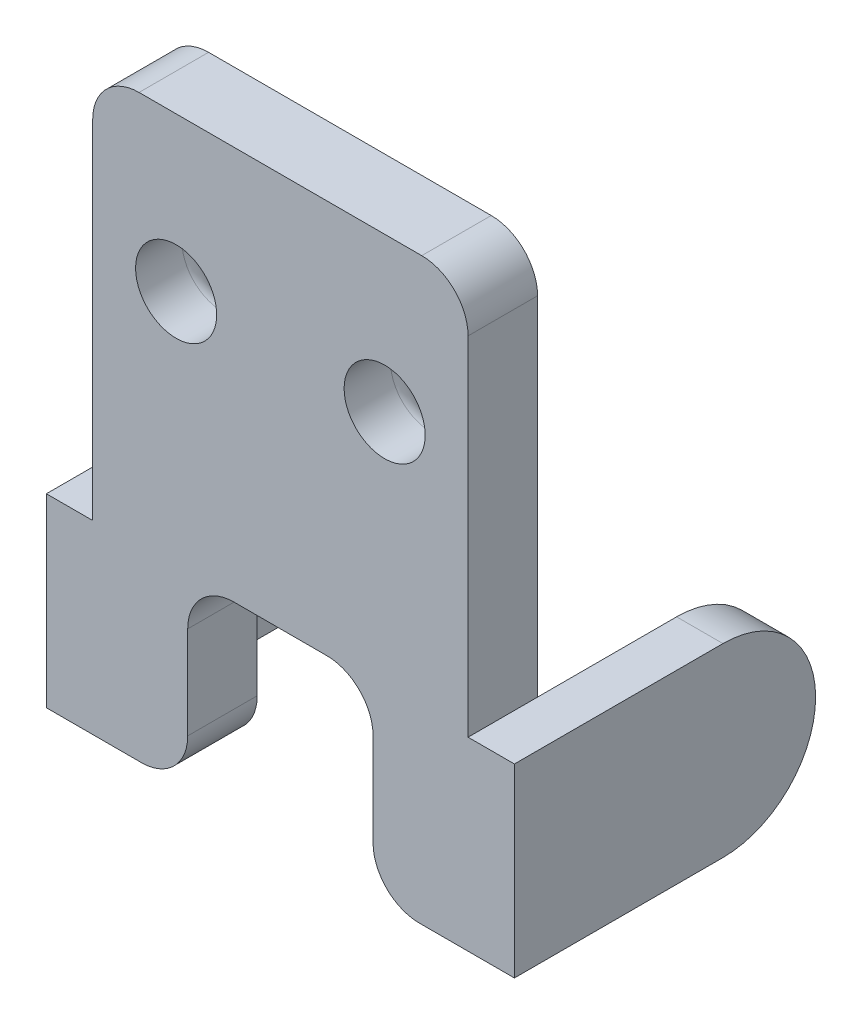
ISO-10303-21;
HEADER;
FILE_DESCRIPTION(('STEP AP214'),'2;1');
FILE_NAME('part.step','',(''),(''),'','','');
FILE_SCHEMA(('AUTOMOTIVE_DESIGN { 1 0 10303 214 1 1 1 1 }'));
ENDSEC;
DATA;
#1=APPLICATION_CONTEXT('core data for automotive mechanical design processes');
#2=APPLICATION_PROTOCOL_DEFINITION('international standard','automotive_design',2000,#1);
#3=PRODUCT_CONTEXT('',#1,'mechanical');
#4=PRODUCT('Part','Part','',(#3));
#5=PRODUCT_RELATED_PRODUCT_CATEGORY('part','',(#4));
#6=PRODUCT_DEFINITION_FORMATION('','',#4);
#7=PRODUCT_DEFINITION_CONTEXT('part definition',#1,'design');
#8=PRODUCT_DEFINITION('design','',#6,#7);
#9=PRODUCT_DEFINITION_SHAPE('','',#8);
#10=(LENGTH_UNIT() NAMED_UNIT(*) SI_UNIT(.MILLI.,.METRE.));
#11=(NAMED_UNIT(*) PLANE_ANGLE_UNIT() SI_UNIT($,.RADIAN.));
#12=(NAMED_UNIT(*) SI_UNIT($,.STERADIAN.) SOLID_ANGLE_UNIT());
#13=UNCERTAINTY_MEASURE_WITH_UNIT(LENGTH_MEASURE(1.E-05),#10,'distance_accuracy_value','');
#14=(GEOMETRIC_REPRESENTATION_CONTEXT(3) GLOBAL_UNCERTAINTY_ASSIGNED_CONTEXT((#13)) GLOBAL_UNIT_ASSIGNED_CONTEXT((#10,
#11,#12)) REPRESENTATION_CONTEXT('',''));
#15=CARTESIAN_POINT('',(0.,0.,0.));
#16=DIRECTION('',(0.,0.,1.));
#17=DIRECTION('',(1.,0.,0.));
#18=AXIS2_PLACEMENT_3D('',#15,#16,#17);
#19=CARTESIAN_POINT('',(0.,0.,3.));
#20=DIRECTION('',(0.,1.,0.));
#21=DIRECTION('',(0.,0.,1.));
#22=AXIS2_PLACEMENT_3D('',#19,#20,#21);
#23=PLANE('',#22);
#24=DIRECTION('',(1.,0.,0.));
#25=VECTOR('',#24,1.);
#26=CARTESIAN_POINT('',(0.,0.,3.));
#27=LINE('',#26,#25);
#28=CARTESIAN_POINT('',(14.1,0.,3.));
#29=VERTEX_POINT('',#28);
#30=CARTESIAN_POINT('',(18.2,0.,3.));
#31=VERTEX_POINT('',#30);
#32=EDGE_CURVE('E190',#29,#31,#27,.T.);
#33=ORIENTED_EDGE('',*,*,#32,.F.);
#34=DIRECTION('',(0.,0.,-1.));
#35=VECTOR('',#34,1.);
#36=CARTESIAN_POINT('',(14.1,0.,3.));
#37=LINE('',#36,#35);
#38=CARTESIAN_POINT('',(14.1,0.,0.));
#39=VERTEX_POINT('',#38);
#40=EDGE_CURVE('E341',#29,#39,#37,.T.);
#41=ORIENTED_EDGE('',*,*,#40,.T.);
#42=DIRECTION('',(1.,0.,0.));
#43=VECTOR('',#42,1.);
#44=CARTESIAN_POINT('',(0.,0.,0.));
#45=LINE('',#44,#43);
#46=CARTESIAN_POINT('',(16.2,0.,0.));
#47=VERTEX_POINT('',#46);
#48=EDGE_CURVE('E262',#39,#47,#45,.T.);
#49=ORIENTED_EDGE('',*,*,#48,.T.);
#50=DIRECTION('',(0.,0.,-1.));
#51=VECTOR('',#50,1.);
#52=CARTESIAN_POINT('',(16.2,0.,3.));
#53=LINE('',#52,#51);
#54=CARTESIAN_POINT('',(16.2,0.,-6.));
#55=VERTEX_POINT('',#54);
#56=EDGE_CURVE('E219',#47,#55,#53,.T.);
#57=ORIENTED_EDGE('',*,*,#56,.T.);
#58=DIRECTION('',(-1.,0.,0.));
#59=VECTOR('',#58,1.);
#60=CARTESIAN_POINT('',(0.,0.,-6.));
#61=LINE('',#60,#59);
#62=CARTESIAN_POINT('',(18.2,0.,-6.));
#63=VERTEX_POINT('',#62);
#64=EDGE_CURVE('E209',#55,#63,#61,.F.);
#65=ORIENTED_EDGE('',*,*,#64,.T.);
#66=DIRECTION('',(0.,0.,-1.));
#67=VECTOR('',#66,1.);
#68=CARTESIAN_POINT('',(18.2,0.,3.));
#69=LINE('',#68,#67);
#70=EDGE_CURVE('E206',#31,#63,#69,.T.);
#71=ORIENTED_EDGE('',*,*,#70,.F.);
#72=EDGE_LOOP('',(#33,#41,#49,#57,#65,#71));
#73=FACE_BOUND('',#72,.T.);
#74=ADVANCED_FACE('F34',(#73),#23,.F.);
#75=CARTESIAN_POINT('',(16.2,0.,3.));
#76=DIRECTION('',(-1.,0.,0.));
#77=DIRECTION('',(0.,0.,1.));
#78=AXIS2_PLACEMENT_3D('',#75,#76,#77);
#79=PLANE('',#78);
#80=DIRECTION('',(0.,1.,0.));
#81=VECTOR('',#80,1.);
#82=CARTESIAN_POINT('',(16.2,0.,0.));
#83=LINE('',#82,#81);
#84=CARTESIAN_POINT('',(16.2,8.,0.));
#85=VERTEX_POINT('',#84);
#86=CARTESIAN_POINT('',(16.2,23.,0.));
#87=VERTEX_POINT('',#86);
#88=EDGE_CURVE('E266',#85,#87,#83,.T.);
#89=ORIENTED_EDGE('',*,*,#88,.T.);
#90=DIRECTION('',(0.,0.,-1.));
#91=VECTOR('',#90,1.);
#92=CARTESIAN_POINT('',(16.2,23.,3.));
#93=LINE('',#92,#91);
#94=CARTESIAN_POINT('',(16.2,23.,3.));
#95=VERTEX_POINT('',#94);
#96=EDGE_CURVE('E11',#87,#95,#93,.F.);
#97=ORIENTED_EDGE('',*,*,#96,.T.);
#98=DIRECTION('',(0.,1.,0.));
#99=VECTOR('',#98,1.);
#100=CARTESIAN_POINT('',(16.2,0.,3.));
#101=LINE('',#100,#99);
#102=CARTESIAN_POINT('',(16.2,8.,3.));
#103=VERTEX_POINT('',#102);
#104=EDGE_CURVE('E255',#103,#95,#101,.T.);
#105=ORIENTED_EDGE('',*,*,#104,.F.);
#106=DIRECTION('',(0.,0.,1.));
#107=VECTOR('',#106,1.);
#108=CARTESIAN_POINT('',(16.2,8.,3.));
#109=LINE('',#108,#107);
#110=EDGE_CURVE('E221',#85,#103,#109,.T.);
#111=ORIENTED_EDGE('',*,*,#110,.F.);
#112=EDGE_LOOP('',(#89,#97,#105,#111));
#113=FACE_BOUND('',#112,.T.);
#114=ADVANCED_FACE('F384',(#113),#79,.F.);
#115=CARTESIAN_POINT('',(0.,0.,3.));
#116=DIRECTION('',(1.,0.,0.));
#117=DIRECTION('',(0.,0.,-1.));
#118=AXIS2_PLACEMENT_3D('',#115,#116,#117);
#119=PLANE('',#118);
#120=DIRECTION('',(0.,-1.,0.));
#121=VECTOR('',#120,1.);
#122=CARTESIAN_POINT('',(0.,0.,3.));
#123=LINE('',#122,#121);
#124=CARTESIAN_POINT('',(0.,23.,3.));
#125=VERTEX_POINT('',#124);
#126=CARTESIAN_POINT('',(0.,8.,3.));
#127=VERTEX_POINT('',#126);
#128=EDGE_CURVE('E203',#125,#127,#123,.T.);
#129=ORIENTED_EDGE('',*,*,#128,.F.);
#130=DIRECTION('',(0.,0.,-1.));
#131=VECTOR('',#130,1.);
#132=CARTESIAN_POINT('',(0.,23.,3.));
#133=LINE('',#132,#131);
#134=CARTESIAN_POINT('',(0.,23.,0.));
#135=VERTEX_POINT('',#134);
#136=EDGE_CURVE('E351',#125,#135,#133,.T.);
#137=ORIENTED_EDGE('',*,*,#136,.T.);
#138=DIRECTION('',(0.,-1.,0.));
#139=VECTOR('',#138,1.);
#140=CARTESIAN_POINT('',(0.,0.,0.));
#141=LINE('',#140,#139);
#142=CARTESIAN_POINT('',(0.,8.,0.));
#143=VERTEX_POINT('',#142);
#144=EDGE_CURVE('E260',#135,#143,#141,.T.);
#145=ORIENTED_EDGE('',*,*,#144,.T.);
#146=DIRECTION('',(0.,0.,-1.));
#147=VECTOR('',#146,1.);
#148=CARTESIAN_POINT('',(0.,8.,3.));
#149=LINE('',#148,#147);
#150=EDGE_CURVE('E245',#127,#143,#149,.T.);
#151=ORIENTED_EDGE('',*,*,#150,.F.);
#152=EDGE_LOOP('',(#129,#137,#145,#151));
#153=FACE_BOUND('',#152,.T.);
#154=ADVANCED_FACE('F370',(#153),#119,.F.);
#155=CARTESIAN_POINT('',(0.,0.,0.));
#156=VERTEX_POINT('',#155);
#157=CARTESIAN_POINT('',(2.1,0.,0.));
#158=VERTEX_POINT('',#157);
#159=EDGE_CURVE('E263',#156,#158,#45,.T.);
#160=ORIENTED_EDGE('',*,*,#159,.T.);
#161=DIRECTION('',(0.,0.,-1.));
#162=VECTOR('',#161,1.);
#163=CARTESIAN_POINT('',(2.1,0.,3.));
#164=LINE('',#163,#162);
#165=CARTESIAN_POINT('',(2.1,0.,3.));
#166=VERTEX_POINT('',#165);
#167=EDGE_CURVE('E326',#158,#166,#164,.F.);
#168=ORIENTED_EDGE('',*,*,#167,.T.);
#169=CARTESIAN_POINT('',(-2.,0.,3.));
#170=VERTEX_POINT('',#169);
#171=EDGE_CURVE('E202',#170,#166,#27,.T.);
#172=ORIENTED_EDGE('',*,*,#171,.F.);
#173=DIRECTION('',(0.,0.,1.));
#174=VECTOR('',#173,1.);
#175=CARTESIAN_POINT('',(-2.,0.,3.));
#176=LINE('',#175,#174);
#177=CARTESIAN_POINT('',(-2.,0.,-6.));
#178=VERTEX_POINT('',#177);
#179=EDGE_CURVE('E242',#178,#170,#176,.T.);
#180=ORIENTED_EDGE('',*,*,#179,.F.);
#181=DIRECTION('',(1.,0.,0.));
#182=VECTOR('',#181,1.);
#183=CARTESIAN_POINT('',(0.,0.,-6.));
#184=LINE('',#183,#182);
#185=CARTESIAN_POINT('',(0.,0.,-6.));
#186=VERTEX_POINT('',#185);
#187=EDGE_CURVE('E296',#178,#186,#184,.T.);
#188=ORIENTED_EDGE('',*,*,#187,.T.);
#189=DIRECTION('',(0.,0.,1.));
#190=VECTOR('',#189,1.);
#191=CARTESIAN_POINT('',(0.,0.,3.));
#192=LINE('',#191,#190);
#193=EDGE_CURVE('E239',#186,#156,#192,.T.);
#194=ORIENTED_EDGE('',*,*,#193,.T.);
#195=EDGE_LOOP('',(#160,#168,#172,#180,#188,#194));
#196=FACE_BOUND('',#195,.T.);
#197=ADVANCED_FACE('F442',(#196),#23,.F.);
#198=CARTESIAN_POINT('',(0.,25.,3.));
#199=DIRECTION('',(0.,-1.,0.));
#200=DIRECTION('',(0.,0.,-1.));
#201=AXIS2_PLACEMENT_3D('',#198,#199,#200);
#202=PLANE('',#201);
#203=DIRECTION('',(-1.,0.,0.));
#204=VECTOR('',#203,1.);
#205=CARTESIAN_POINT('',(0.,25.,0.));
#206=LINE('',#205,#204);
#207=CARTESIAN_POINT('',(14.2,25.,0.));
#208=VERTEX_POINT('',#207);
#209=CARTESIAN_POINT('',(2.,25.,0.));
#210=VERTEX_POINT('',#209);
#211=EDGE_CURVE('E252',#208,#210,#206,.T.);
#212=ORIENTED_EDGE('',*,*,#211,.T.);
#213=DIRECTION('',(0.,0.,-1.));
#214=VECTOR('',#213,1.);
#215=CARTESIAN_POINT('',(2.,25.,3.));
#216=LINE('',#215,#214);
#217=CARTESIAN_POINT('',(2.,25.,3.));
#218=VERTEX_POINT('',#217);
#219=EDGE_CURVE('E55',#210,#218,#216,.F.);
#220=ORIENTED_EDGE('',*,*,#219,.T.);
#221=DIRECTION('',(-1.,0.,0.));
#222=VECTOR('',#221,1.);
#223=CARTESIAN_POINT('',(0.,25.,3.));
#224=LINE('',#223,#222);
#225=CARTESIAN_POINT('',(14.2,25.,3.));
#226=VERTEX_POINT('',#225);
#227=EDGE_CURVE('E257',#226,#218,#224,.T.);
#228=ORIENTED_EDGE('',*,*,#227,.F.);
#229=DIRECTION('',(0.,0.,-1.));
#230=VECTOR('',#229,1.);
#231=CARTESIAN_POINT('',(14.2,25.,3.));
#232=LINE('',#231,#230);
#233=EDGE_CURVE('E358',#226,#208,#232,.T.);
#234=ORIENTED_EDGE('',*,*,#233,.T.);
#235=EDGE_LOOP('',(#212,#220,#228,#234));
#236=FACE_BOUND('',#235,.T.);
#237=ADVANCED_FACE('F377',(#236),#202,.F.);
#238=CARTESIAN_POINT('',(0.,0.,3.));
#239=DIRECTION('',(0.,0.,-1.));
#240=DIRECTION('',(-1.,0.,0.));
#241=AXIS2_PLACEMENT_3D('',#238,#239,#240);
#242=PLANE('',#241);
#243=CARTESIAN_POINT('',(3.6,18.360124913352,3.));
#244=DIRECTION('',(0.,0.,-1.));
#245=DIRECTION('',(-1.,0.,0.));
#246=AXIS2_PLACEMENT_3D('',#243,#244,#245);
#247=CIRCLE('',#246,1.75);
#248=CARTESIAN_POINT('',(1.85,18.360124913352,3.));
#249=VERTEX_POINT('',#248);
#250=EDGE_CURVE('E314',#249,#249,#247,.F.);
#251=ORIENTED_EDGE('',*,*,#250,.F.);
#252=EDGE_LOOP('',(#251));
#253=FACE_BOUND('',#252,.T.);
#254=CARTESIAN_POINT('',(12.6,18.360124913352,3.));
#255=DIRECTION('',(0.,0.,-1.));
#256=DIRECTION('',(-1.,0.,0.));
#257=AXIS2_PLACEMENT_3D('',#254,#255,#256);
#258=CIRCLE('',#257,1.75);
#259=CARTESIAN_POINT('',(10.85,18.360124913352,3.));
#260=VERTEX_POINT('',#259);
#261=EDGE_CURVE('E472',#260,#260,#258,.F.);
#262=ORIENTED_EDGE('',*,*,#261,.F.);
#263=EDGE_LOOP('',(#262));
#264=FACE_BOUND('',#263,.T.);
#265=ORIENTED_EDGE('',*,*,#227,.T.);
#266=CARTESIAN_POINT('',(2.,23.,3.));
#267=DIRECTION('',(0.,0.,-1.));
#268=DIRECTION('',(-1.,0.,0.));
#269=AXIS2_PLACEMENT_3D('',#266,#267,#268);
#270=CIRCLE('',#269,2.);
#271=EDGE_CURVE('E42',#218,#125,#270,.F.);
#272=ORIENTED_EDGE('',*,*,#271,.T.);
#273=ORIENTED_EDGE('',*,*,#128,.T.);
#274=DIRECTION('',(1.,0.,0.));
#275=VECTOR('',#274,1.);
#276=CARTESIAN_POINT('',(-2.,8.,3.));
#277=LINE('',#276,#275);
#278=CARTESIAN_POINT('',(-2.,8.,3.));
#279=VERTEX_POINT('',#278);
#280=EDGE_CURVE('E244',#279,#127,#277,.T.);
#281=ORIENTED_EDGE('',*,*,#280,.F.);
#282=DIRECTION('',(0.,1.,0.));
#283=VECTOR('',#282,1.);
#284=CARTESIAN_POINT('',(-2.,0.,3.));
#285=LINE('',#284,#283);
#286=EDGE_CURVE('E235',#170,#279,#285,.T.);
#287=ORIENTED_EDGE('',*,*,#286,.F.);
#288=ORIENTED_EDGE('',*,*,#171,.T.);
#289=CARTESIAN_POINT('',(2.1,2.,3.));
#290=DIRECTION('',(0.,0.,-1.));
#291=DIRECTION('',(-1.,0.,0.));
#292=AXIS2_PLACEMENT_3D('',#289,#290,#291);
#293=CIRCLE('',#292,2.);
#294=CARTESIAN_POINT('',(4.1,2.,3.));
#295=VERTEX_POINT('',#294);
#296=EDGE_CURVE('E329',#166,#295,#293,.F.);
#297=ORIENTED_EDGE('',*,*,#296,.T.);
#298=DIRECTION('',(0.,-1.,0.));
#299=VECTOR('',#298,1.);
#300=CARTESIAN_POINT('',(4.1,0.,3.));
#301=LINE('',#300,#299);
#302=CARTESIAN_POINT('',(4.09999999999999,6.,3.));
#303=VERTEX_POINT('',#302);
#304=EDGE_CURVE('E413',#303,#295,#301,.T.);
#305=ORIENTED_EDGE('',*,*,#304,.F.);
#306=CARTESIAN_POINT('',(6.09999999999999,6.,3.));
#307=DIRECTION('',(0.,0.,-1.));
#308=DIRECTION('',(-1.,0.,0.));
#309=AXIS2_PLACEMENT_3D('',#306,#307,#308);
#310=CIRCLE('',#309,2.);
#311=CARTESIAN_POINT('',(6.09999999999999,8.,3.));
#312=VERTEX_POINT('',#311);
#313=EDGE_CURVE('E345',#303,#312,#310,.T.);
#314=ORIENTED_EDGE('',*,*,#313,.T.);
#315=DIRECTION('',(-1.,0.,0.));
#316=VECTOR('',#315,1.);
#317=CARTESIAN_POINT('',(12.1,8.,3.));
#318=LINE('',#317,#316);
#319=CARTESIAN_POINT('',(10.1,8.,3.));
#320=VERTEX_POINT('',#319);
#321=EDGE_CURVE('E408',#320,#312,#318,.T.);
#322=ORIENTED_EDGE('',*,*,#321,.F.);
#323=CARTESIAN_POINT('',(10.1,6.,3.));
#324=DIRECTION('',(0.,0.,-1.));
#325=DIRECTION('',(-1.,0.,0.));
#326=AXIS2_PLACEMENT_3D('',#323,#324,#325);
#327=CIRCLE('',#326,2.);
#328=CARTESIAN_POINT('',(12.1,6.,3.));
#329=VERTEX_POINT('',#328);
#330=EDGE_CURVE('E349',#320,#329,#327,.T.);
#331=ORIENTED_EDGE('',*,*,#330,.T.);
#332=DIRECTION('',(0.,1.,0.));
#333=VECTOR('',#332,1.);
#334=CARTESIAN_POINT('',(12.1,0.,3.));
#335=LINE('',#334,#333);
#336=CARTESIAN_POINT('',(12.1,2.,3.));
#337=VERTEX_POINT('',#336);
#338=EDGE_CURVE('E403',#337,#329,#335,.T.);
#339=ORIENTED_EDGE('',*,*,#338,.F.);
#340=CARTESIAN_POINT('',(14.1,2.,3.));
#341=DIRECTION('',(0.,0.,-1.));
#342=DIRECTION('',(-1.,0.,0.));
#343=AXIS2_PLACEMENT_3D('',#340,#341,#342);
#344=CIRCLE('',#343,2.);
#345=EDGE_CURVE('E198',#337,#29,#344,.F.);
#346=ORIENTED_EDGE('',*,*,#345,.T.);
#347=ORIENTED_EDGE('',*,*,#32,.T.);
#348=DIRECTION('',(0.,-1.,0.));
#349=VECTOR('',#348,1.);
#350=CARTESIAN_POINT('',(18.2,0.,3.));
#351=LINE('',#350,#349);
#352=CARTESIAN_POINT('',(18.2,8.,3.));
#353=VERTEX_POINT('',#352);
#354=EDGE_CURVE('E195',#353,#31,#351,.T.);
#355=ORIENTED_EDGE('',*,*,#354,.F.);
#356=DIRECTION('',(-1.,0.,0.));
#357=VECTOR('',#356,1.);
#358=CARTESIAN_POINT('',(18.2,8.,3.));
#359=LINE('',#358,#357);
#360=EDGE_CURVE('E227',#353,#103,#359,.T.);
#361=ORIENTED_EDGE('',*,*,#360,.T.);
#362=ORIENTED_EDGE('',*,*,#104,.T.);
#363=CARTESIAN_POINT('',(14.2,23.,3.));
#364=DIRECTION('',(0.,0.,-1.));
#365=DIRECTION('',(-1.,0.,0.));
#366=AXIS2_PLACEMENT_3D('',#363,#364,#365);
#367=CIRCLE('',#366,2.);
#368=EDGE_CURVE('E362',#95,#226,#367,.F.);
#369=ORIENTED_EDGE('',*,*,#368,.T.);
#370=EDGE_LOOP('',(#265,#272,#273,#281,#287,#288,#297,#305,#314,#322,#331,#339,#346,#347,#355,
#361,#362,#369));
#371=FACE_BOUND('',#370,.T.);
#372=ADVANCED_FACE('F192',(#253,#264,#371),#242,.F.);
#373=CARTESIAN_POINT('',(0.,0.,0.));
#374=DIRECTION('',(0.,0.,-1.));
#375=DIRECTION('',(-1.,0.,0.));
#376=AXIS2_PLACEMENT_3D('',#373,#374,#375);
#377=PLANE('',#376);
#378=CARTESIAN_POINT('',(3.6,18.360124913352,0.));
#379=DIRECTION('',(0.,0.,-1.));
#380=DIRECTION('',(-1.,0.,0.));
#381=AXIS2_PLACEMENT_3D('',#378,#379,#380);
#382=CIRCLE('',#381,2.75);
#383=CARTESIAN_POINT('',(0.849999999999998,18.360124913352,0.));
#384=VERTEX_POINT('',#383);
#385=EDGE_CURVE('E279',#384,#384,#382,.F.);
#386=ORIENTED_EDGE('',*,*,#385,.T.);
#387=EDGE_LOOP('',(#386));
#388=FACE_BOUND('',#387,.T.);
#389=CARTESIAN_POINT('',(12.6,18.360124913352,0.));
#390=DIRECTION('',(0.,0.,-1.));
#391=DIRECTION('',(-1.,0.,0.));
#392=AXIS2_PLACEMENT_3D('',#389,#390,#391);
#393=CIRCLE('',#392,2.75);
#394=CARTESIAN_POINT('',(9.85,18.360124913352,0.));
#395=VERTEX_POINT('',#394);
#396=EDGE_CURVE('E276',#395,#395,#393,.F.);
#397=ORIENTED_EDGE('',*,*,#396,.T.);
#398=EDGE_LOOP('',(#397));
#399=FACE_BOUND('',#398,.T.);
#400=ORIENTED_EDGE('',*,*,#144,.F.);
#401=CARTESIAN_POINT('',(2.,23.,0.));
#402=DIRECTION('',(0.,0.,-1.));
#403=DIRECTION('',(-1.,0.,0.));
#404=AXIS2_PLACEMENT_3D('',#401,#402,#403);
#405=CIRCLE('',#404,2.);
#406=EDGE_CURVE('E356',#135,#210,#405,.T.);
#407=ORIENTED_EDGE('',*,*,#406,.T.);
#408=ORIENTED_EDGE('',*,*,#211,.F.);
#409=CARTESIAN_POINT('',(14.2,23.,0.));
#410=DIRECTION('',(0.,0.,-1.));
#411=DIRECTION('',(-1.,0.,0.));
#412=AXIS2_PLACEMENT_3D('',#409,#410,#411);
#413=CIRCLE('',#412,2.);
#414=EDGE_CURVE('E354',#208,#87,#413,.T.);
#415=ORIENTED_EDGE('',*,*,#414,.T.);
#416=ORIENTED_EDGE('',*,*,#88,.F.);
#417=EDGE_CURVE('E267',#47,#85,#83,.T.);
#418=ORIENTED_EDGE('',*,*,#417,.F.);
#419=ORIENTED_EDGE('',*,*,#48,.F.);
#420=CARTESIAN_POINT('',(14.1,2.,0.));
#421=DIRECTION('',(0.,0.,-1.));
#422=DIRECTION('',(-1.,0.,0.));
#423=AXIS2_PLACEMENT_3D('',#420,#421,#422);
#424=CIRCLE('',#423,2.);
#425=CARTESIAN_POINT('',(12.1,2.,0.));
#426=VERTEX_POINT('',#425);
#427=EDGE_CURVE('E322',#39,#426,#424,.T.);
#428=ORIENTED_EDGE('',*,*,#427,.T.);
#429=DIRECTION('',(0.,-1.,0.));
#430=VECTOR('',#429,1.);
#431=CARTESIAN_POINT('',(12.1,0.,0.));
#432=LINE('',#431,#430);
#433=CARTESIAN_POINT('',(12.1,6.,0.));
#434=VERTEX_POINT('',#433);
#435=EDGE_CURVE('E405',#434,#426,#432,.T.);
#436=ORIENTED_EDGE('',*,*,#435,.F.);
#437=CARTESIAN_POINT('',(10.1,6.,0.));
#438=DIRECTION('',(0.,0.,-1.));
#439=DIRECTION('',(-1.,0.,0.));
#440=AXIS2_PLACEMENT_3D('',#437,#438,#439);
#441=CIRCLE('',#440,2.);
#442=CARTESIAN_POINT('',(10.1,8.,0.));
#443=VERTEX_POINT('',#442);
#444=EDGE_CURVE('E347',#434,#443,#441,.F.);
#445=ORIENTED_EDGE('',*,*,#444,.T.);
#446=DIRECTION('',(1.,0.,0.));
#447=VECTOR('',#446,1.);
#448=CARTESIAN_POINT('',(12.1,8.,0.));
#449=LINE('',#448,#447);
#450=CARTESIAN_POINT('',(6.09999999999999,8.,0.));
#451=VERTEX_POINT('',#450);
#452=EDGE_CURVE('E419',#451,#443,#449,.T.);
#453=ORIENTED_EDGE('',*,*,#452,.F.);
#454=CARTESIAN_POINT('',(6.09999999999999,6.,0.));
#455=DIRECTION('',(0.,0.,-1.));
#456=DIRECTION('',(-1.,0.,0.));
#457=AXIS2_PLACEMENT_3D('',#454,#455,#456);
#458=CIRCLE('',#457,2.);
#459=CARTESIAN_POINT('',(4.09999999999999,6.,0.));
#460=VERTEX_POINT('',#459);
#461=EDGE_CURVE('E343',#451,#460,#458,.F.);
#462=ORIENTED_EDGE('',*,*,#461,.T.);
#463=DIRECTION('',(0.,1.,0.));
#464=VECTOR('',#463,1.);
#465=CARTESIAN_POINT('',(4.1,0.,0.));
#466=LINE('',#465,#464);
#467=CARTESIAN_POINT('',(4.1,2.,0.));
#468=VERTEX_POINT('',#467);
#469=EDGE_CURVE('E410',#468,#460,#466,.T.);
#470=ORIENTED_EDGE('',*,*,#469,.F.);
#471=CARTESIAN_POINT('',(2.1,2.,0.));
#472=DIRECTION('',(0.,0.,-1.));
#473=DIRECTION('',(-1.,0.,0.));
#474=AXIS2_PLACEMENT_3D('',#471,#472,#473);
#475=CIRCLE('',#474,2.);
#476=EDGE_CURVE('E324',#468,#158,#475,.T.);
#477=ORIENTED_EDGE('',*,*,#476,.T.);
#478=ORIENTED_EDGE('',*,*,#159,.F.);
#479=EDGE_CURVE('E251',#143,#156,#141,.T.);
#480=ORIENTED_EDGE('',*,*,#479,.F.);
#481=EDGE_LOOP('',(#400,#407,#408,#415,#416,#418,#419,#428,#436,#445,#453,#462,#470,#477,#478,#480));
#482=FACE_BOUND('',#481,.T.);
#483=ADVANCED_FACE('F375',(#388,#399,#482),#377,.T.);
#484=CARTESIAN_POINT('',(0.,0.,0.));
#485=DIRECTION('',(-1.,0.,0.));
#486=DIRECTION('',(0.,0.,1.));
#487=AXIS2_PLACEMENT_3D('',#484,#485,#486);
#488=PLANE('',#487);
#489=CARTESIAN_POINT('',(0.,4.03577497147012,-7.));
#490=DIRECTION('',(-1.,0.,0.));
#491=DIRECTION('',(0.,0.,1.));
#492=AXIS2_PLACEMENT_3D('',#489,#490,#491);
#493=CIRCLE('',#492,1.8);
#494=CARTESIAN_POINT('',(0.,4.03577497147012,-5.2));
#495=VERTEX_POINT('',#494);
#496=EDGE_CURVE('E259',#495,#495,#493,.F.);
#497=ORIENTED_EDGE('',*,*,#496,.F.);
#498=EDGE_LOOP('',(#497));
#499=FACE_BOUND('',#498,.T.);
#500=CARTESIAN_POINT('',(0.,4.,-6.));
#501=DIRECTION('',(-1.,0.,0.));
#502=DIRECTION('',(0.,0.,1.));
#503=AXIS2_PLACEMENT_3D('',#500,#501,#502);
#504=CIRCLE('',#503,4.);
#505=CARTESIAN_POINT('',(0.,4.,-10.));
#506=VERTEX_POINT('',#505);
#507=EDGE_CURVE('E285',#186,#506,#504,.F.);
#508=ORIENTED_EDGE('',*,*,#507,.T.);
#509=CARTESIAN_POINT('',(0.,4.,-6.));
#510=DIRECTION('',(-1.,0.,0.));
#511=DIRECTION('',(0.,0.,1.));
#512=AXIS2_PLACEMENT_3D('',#509,#510,#511);
#513=CIRCLE('',#512,4.);
#514=CARTESIAN_POINT('',(0.,8.,-6.));
#515=VERTEX_POINT('',#514);
#516=EDGE_CURVE('E287',#506,#515,#513,.F.);
#517=ORIENTED_EDGE('',*,*,#516,.T.);
#518=EDGE_CURVE('E234',#143,#515,#149,.T.);
#519=ORIENTED_EDGE('',*,*,#518,.F.);
#520=ORIENTED_EDGE('',*,*,#479,.T.);
#521=ORIENTED_EDGE('',*,*,#193,.F.);
#522=EDGE_LOOP('',(#508,#517,#519,#520,#521));
#523=FACE_BOUND('',#522,.T.);
#524=ADVANCED_FACE('F604',(#499,#523),#488,.F.);
#525=CARTESIAN_POINT('',(-2.,8.,3.));
#526=DIRECTION('',(0.,-1.,0.));
#527=DIRECTION('',(0.,0.,-1.));
#528=AXIS2_PLACEMENT_3D('',#525,#526,#527);
#529=PLANE('',#528);
#530=ORIENTED_EDGE('',*,*,#518,.T.);
#531=DIRECTION('',(1.,0.,0.));
#532=VECTOR('',#531,1.);
#533=CARTESIAN_POINT('',(-2.,8.,-6.));
#534=LINE('',#533,#532);
#535=CARTESIAN_POINT('',(-2.,8.,-6.));
#536=VERTEX_POINT('',#535);
#537=EDGE_CURVE('E289',#515,#536,#534,.F.);
#538=ORIENTED_EDGE('',*,*,#537,.T.);
#539=DIRECTION('',(0.,0.,-1.));
#540=VECTOR('',#539,1.);
#541=CARTESIAN_POINT('',(-2.,8.,3.));
#542=LINE('',#541,#540);
#543=EDGE_CURVE('E238',#279,#536,#542,.T.);
#544=ORIENTED_EDGE('',*,*,#543,.F.);
#545=ORIENTED_EDGE('',*,*,#280,.T.);
#546=ORIENTED_EDGE('',*,*,#150,.T.);
#547=EDGE_LOOP('',(#530,#538,#544,#545,#546));
#548=FACE_BOUND('',#547,.T.);
#549=ADVANCED_FACE('F698',(#548),#529,.F.);
#550=CARTESIAN_POINT('',(-2.,0.,0.));
#551=DIRECTION('',(-1.,0.,0.));
#552=DIRECTION('',(0.,0.,1.));
#553=AXIS2_PLACEMENT_3D('',#550,#551,#552);
#554=PLANE('',#553);
#555=ORIENTED_EDGE('',*,*,#543,.T.);
#556=CARTESIAN_POINT('',(-2.,4.,-6.));
#557=DIRECTION('',(-1.,0.,0.));
#558=DIRECTION('',(0.,0.,1.));
#559=AXIS2_PLACEMENT_3D('',#556,#557,#558);
#560=CIRCLE('',#559,4.);
#561=CARTESIAN_POINT('',(-2.,4.,-10.));
#562=VERTEX_POINT('',#561);
#563=EDGE_CURVE('E294',#536,#562,#560,.T.);
#564=ORIENTED_EDGE('',*,*,#563,.T.);
#565=CARTESIAN_POINT('',(-2.,4.,-6.));
#566=DIRECTION('',(-1.,0.,0.));
#567=DIRECTION('',(0.,0.,1.));
#568=AXIS2_PLACEMENT_3D('',#565,#566,#567);
#569=CIRCLE('',#568,4.);
#570=EDGE_CURVE('E292',#562,#178,#569,.T.);
#571=ORIENTED_EDGE('',*,*,#570,.T.);
#572=ORIENTED_EDGE('',*,*,#179,.T.);
#573=ORIENTED_EDGE('',*,*,#286,.T.);
#574=EDGE_LOOP('',(#555,#564,#571,#572,#573));
#575=FACE_BOUND('',#574,.T.);
#576=ADVANCED_FACE('F707',(#575),#554,.T.);
#577=CARTESIAN_POINT('',(1.5,4.03577497147012,-7.));
#578=DIRECTION('',(-1.,0.,0.));
#579=DIRECTION('',(0.,0.,1.));
#580=AXIS2_PLACEMENT_3D('',#577,#578,#579);
#581=CYLINDRICAL_SURFACE('',#580,1.8);
#582=CARTESIAN_POINT('',(1.5,4.03577497147012,-7.));
#583=DIRECTION('',(1.,0.,0.));
#584=DIRECTION('',(0.,0.,-1.));
#585=AXIS2_PLACEMENT_3D('',#582,#583,#584);
#586=CIRCLE('',#585,1.8);
#587=CARTESIAN_POINT('',(1.5,4.03577497147012,-8.8));
#588=VERTEX_POINT('',#587);
#589=EDGE_CURVE('E231',#588,#588,#586,.T.);
#590=ORIENTED_EDGE('',*,*,#589,.F.);
#591=EDGE_LOOP('',(#590));
#592=FACE_BOUND('',#591,.T.);
#593=ORIENTED_EDGE('',*,*,#496,.T.);
#594=EDGE_LOOP('',(#593));
#595=FACE_BOUND('',#594,.T.);
#596=ADVANCED_FACE('F716',(#592,#595),#581,.T.);
#597=CARTESIAN_POINT('',(1.5,4.03577497147012,-7.));
#598=DIRECTION('',(1.,0.,0.));
#599=DIRECTION('',(0.,0.,-1.));
#600=AXIS2_PLACEMENT_3D('',#597,#598,#599);
#601=PLANE('',#600);
#602=ORIENTED_EDGE('',*,*,#589,.T.);
#603=EDGE_LOOP('',(#602));
#604=FACE_BOUND('',#603,.T.);
#605=ADVANCED_FACE('F725',(#604),#601,.T.);
#606=CARTESIAN_POINT('',(18.2,8.,3.));
#607=DIRECTION('',(0.,-1.,0.));
#608=DIRECTION('',(0.,0.,-1.));
#609=AXIS2_PLACEMENT_3D('',#606,#607,#608);
#610=PLANE('',#609);
#611=DIRECTION('',(0.,0.,1.));
#612=VECTOR('',#611,1.);
#613=CARTESIAN_POINT('',(18.2,8.,3.));
#614=LINE('',#613,#612);
#615=CARTESIAN_POINT('',(18.2,8.,-6.));
#616=VERTEX_POINT('',#615);
#617=EDGE_CURVE('E212',#616,#353,#614,.T.);
#618=ORIENTED_EDGE('',*,*,#617,.F.);
#619=DIRECTION('',(-1.,0.,0.));
#620=VECTOR('',#619,1.);
#621=CARTESIAN_POINT('',(18.2,8.,-6.));
#622=LINE('',#621,#620);
#623=CARTESIAN_POINT('',(16.2,8.,-6.));
#624=VERTEX_POINT('',#623);
#625=EDGE_CURVE('E298',#616,#624,#622,.T.);
#626=ORIENTED_EDGE('',*,*,#625,.T.);
#627=EDGE_CURVE('E217',#624,#85,#109,.T.);
#628=ORIENTED_EDGE('',*,*,#627,.T.);
#629=ORIENTED_EDGE('',*,*,#110,.T.);
#630=ORIENTED_EDGE('',*,*,#360,.F.);
#631=EDGE_LOOP('',(#618,#626,#628,#629,#630));
#632=FACE_BOUND('',#631,.T.);
#633=ADVANCED_FACE('F387',(#632),#610,.F.);
#634=CARTESIAN_POINT('',(18.2,0.,0.));
#635=DIRECTION('',(-1.,0.,0.));
#636=DIRECTION('',(0.,0.,1.));
#637=AXIS2_PLACEMENT_3D('',#634,#635,#636);
#638=PLANE('',#637);
#639=CARTESIAN_POINT('',(18.2,4.,-6.));
#640=DIRECTION('',(-1.,0.,0.));
#641=DIRECTION('',(0.,0.,1.));
#642=AXIS2_PLACEMENT_3D('',#639,#640,#641);
#643=CIRCLE('',#642,4.);
#644=CARTESIAN_POINT('',(18.2,4.,-10.));
#645=VERTEX_POINT('',#644);
#646=EDGE_CURVE('E305',#63,#645,#643,.F.);
#647=ORIENTED_EDGE('',*,*,#646,.T.);
#648=CARTESIAN_POINT('',(18.2,4.,-6.));
#649=DIRECTION('',(-1.,0.,0.));
#650=DIRECTION('',(0.,0.,1.));
#651=AXIS2_PLACEMENT_3D('',#648,#649,#650);
#652=CIRCLE('',#651,4.);
#653=EDGE_CURVE('E307',#645,#616,#652,.F.);
#654=ORIENTED_EDGE('',*,*,#653,.T.);
#655=ORIENTED_EDGE('',*,*,#617,.T.);
#656=ORIENTED_EDGE('',*,*,#354,.T.);
#657=ORIENTED_EDGE('',*,*,#70,.T.);
#658=EDGE_LOOP('',(#647,#654,#655,#656,#657));
#659=FACE_BOUND('',#658,.T.);
#660=ADVANCED_FACE('F214',(#659),#638,.F.);
#661=CARTESIAN_POINT('',(16.2,0.,0.));
#662=DIRECTION('',(-1.,0.,0.));
#663=DIRECTION('',(0.,0.,1.));
#664=AXIS2_PLACEMENT_3D('',#661,#662,#663);
#665=PLANE('',#664);
#666=CARTESIAN_POINT('',(16.2,3.87973122911944,-7.));
#667=DIRECTION('',(-1.,0.,0.));
#668=DIRECTION('',(0.,0.,1.));
#669=AXIS2_PLACEMENT_3D('',#666,#667,#668);
#670=CIRCLE('',#669,1.8);
#671=CARTESIAN_POINT('',(16.2,3.87973122911944,-5.2));
#672=VERTEX_POINT('',#671);
#673=EDGE_CURVE('E223',#672,#672,#670,.T.);
#674=ORIENTED_EDGE('',*,*,#673,.F.);
#675=EDGE_LOOP('',(#674));
#676=FACE_BOUND('',#675,.T.);
#677=ORIENTED_EDGE('',*,*,#627,.F.);
#678=CARTESIAN_POINT('',(16.2,4.,-6.));
#679=DIRECTION('',(-1.,0.,0.));
#680=DIRECTION('',(0.,0.,1.));
#681=AXIS2_PLACEMENT_3D('',#678,#679,#680);
#682=CIRCLE('',#681,4.);
#683=CARTESIAN_POINT('',(16.2,4.,-10.));
#684=VERTEX_POINT('',#683);
#685=EDGE_CURVE('E303',#624,#684,#682,.T.);
#686=ORIENTED_EDGE('',*,*,#685,.T.);
#687=CARTESIAN_POINT('',(16.2,4.,-6.));
#688=DIRECTION('',(-1.,0.,0.));
#689=DIRECTION('',(0.,0.,1.));
#690=AXIS2_PLACEMENT_3D('',#687,#688,#689);
#691=CIRCLE('',#690,4.);
#692=EDGE_CURVE('E301',#684,#55,#691,.T.);
#693=ORIENTED_EDGE('',*,*,#692,.T.);
#694=ORIENTED_EDGE('',*,*,#56,.F.);
#695=ORIENTED_EDGE('',*,*,#417,.T.);
#696=EDGE_LOOP('',(#677,#686,#693,#694,#695));
#697=FACE_BOUND('',#696,.T.);
#698=ADVANCED_FACE('F391',(#676,#697),#665,.T.);
#699=CARTESIAN_POINT('',(14.7,3.87973122911944,-7.));
#700=DIRECTION('',(1.,0.,0.));
#701=DIRECTION('',(0.,0.,-1.));
#702=AXIS2_PLACEMENT_3D('',#699,#700,#701);
#703=CYLINDRICAL_SURFACE('',#702,1.8);
#704=CARTESIAN_POINT('',(14.7,3.87973122911944,-7.));
#705=DIRECTION('',(-1.,0.,0.));
#706=DIRECTION('',(0.,0.,1.));
#707=AXIS2_PLACEMENT_3D('',#704,#705,#706);
#708=CIRCLE('',#707,1.8);
#709=CARTESIAN_POINT('',(14.7,3.87973122911944,-5.2));
#710=VERTEX_POINT('',#709);
#711=EDGE_CURVE('E228',#710,#710,#708,.T.);
#712=ORIENTED_EDGE('',*,*,#711,.F.);
#713=EDGE_LOOP('',(#712));
#714=FACE_BOUND('',#713,.T.);
#715=ORIENTED_EDGE('',*,*,#673,.T.);
#716=EDGE_LOOP('',(#715));
#717=FACE_BOUND('',#716,.T.);
#718=ADVANCED_FACE('F427',(#714,#717),#703,.T.);
#719=CARTESIAN_POINT('',(14.7,3.87973122911944,-7.));
#720=DIRECTION('',(-1.,0.,0.));
#721=DIRECTION('',(0.,0.,1.));
#722=AXIS2_PLACEMENT_3D('',#719,#720,#721);
#723=PLANE('',#722);
#724=ORIENTED_EDGE('',*,*,#711,.T.);
#725=EDGE_LOOP('',(#724));
#726=FACE_BOUND('',#725,.T.);
#727=ADVANCED_FACE('F435',(#726),#723,.T.);
#728=CARTESIAN_POINT('',(12.1,0.,3.001));
#729=DIRECTION('',(1.,0.,0.));
#730=DIRECTION('',(0.,0.,-1.));
#731=AXIS2_PLACEMENT_3D('',#728,#729,#730);
#732=PLANE('',#731);
#733=ORIENTED_EDGE('',*,*,#338,.T.);
#734=DIRECTION('',(0.,0.,-1.));
#735=VECTOR('',#734,1.);
#736=CARTESIAN_POINT('',(12.1,6.,0.));
#737=LINE('',#736,#735);
#738=EDGE_CURVE('E338',#329,#434,#737,.T.);
#739=ORIENTED_EDGE('',*,*,#738,.T.);
#740=ORIENTED_EDGE('',*,*,#435,.T.);
#741=DIRECTION('',(0.,0.,-1.));
#742=VECTOR('',#741,1.);
#743=CARTESIAN_POINT('',(12.1,2.,3.001));
#744=LINE('',#743,#742);
#745=EDGE_CURVE('E336',#426,#337,#744,.F.);
#746=ORIENTED_EDGE('',*,*,#745,.T.);
#747=EDGE_LOOP('',(#733,#739,#740,#746));
#748=FACE_BOUND('',#747,.T.);
#749=ADVANCED_FACE('F402',(#748),#732,.F.);
#750=CARTESIAN_POINT('',(12.1,8.,3.001));
#751=DIRECTION('',(0.,1.,0.));
#752=DIRECTION('',(0.,0.,1.));
#753=AXIS2_PLACEMENT_3D('',#750,#751,#752);
#754=PLANE('',#753);
#755=ORIENTED_EDGE('',*,*,#321,.T.);
#756=DIRECTION('',(0.,0.,-1.));
#757=VECTOR('',#756,1.);
#758=CARTESIAN_POINT('',(6.09999999999999,8.,0.));
#759=LINE('',#758,#757);
#760=EDGE_CURVE('E333',#312,#451,#759,.T.);
#761=ORIENTED_EDGE('',*,*,#760,.T.);
#762=ORIENTED_EDGE('',*,*,#452,.T.);
#763=DIRECTION('',(0.,0.,-1.));
#764=VECTOR('',#763,1.);
#765=CARTESIAN_POINT('',(10.1,8.,3.));
#766=LINE('',#765,#764);
#767=EDGE_CURVE('E331',#443,#320,#766,.F.);
#768=ORIENTED_EDGE('',*,*,#767,.T.);
#769=EDGE_LOOP('',(#755,#761,#762,#768));
#770=FACE_BOUND('',#769,.T.);
#771=ADVANCED_FACE('F497',(#770),#754,.F.);
#772=CARTESIAN_POINT('',(4.1,0.,3.001));
#773=DIRECTION('',(-1.,0.,0.));
#774=DIRECTION('',(0.,-1.,0.));
#775=AXIS2_PLACEMENT_3D('',#772,#773,#774);
#776=PLANE('',#775);
#777=ORIENTED_EDGE('',*,*,#304,.T.);
#778=DIRECTION('',(0.,0.,-1.));
#779=VECTOR('',#778,1.);
#780=CARTESIAN_POINT('',(4.1,2.,3.001));
#781=LINE('',#780,#779);
#782=EDGE_CURVE('E319',#295,#468,#781,.T.);
#783=ORIENTED_EDGE('',*,*,#782,.T.);
#784=ORIENTED_EDGE('',*,*,#469,.T.);
#785=DIRECTION('',(0.,0.,-1.));
#786=VECTOR('',#785,1.);
#787=CARTESIAN_POINT('',(4.09999999999999,6.,3.));
#788=LINE('',#787,#786);
#789=EDGE_CURVE('E310',#460,#303,#788,.F.);
#790=ORIENTED_EDGE('',*,*,#789,.T.);
#791=EDGE_LOOP('',(#777,#783,#784,#790));
#792=FACE_BOUND('',#791,.T.);
#793=ADVANCED_FACE('F469',(#792),#776,.F.);
#794=CARTESIAN_POINT('',(12.6,18.360124913352,3.001));
#795=DIRECTION('',(0.,0.,-1.));
#796=DIRECTION('',(-1.,0.,0.));
#797=AXIS2_PLACEMENT_3D('',#794,#795,#796);
#798=CYLINDRICAL_SURFACE('',#797,1.75);
#799=CARTESIAN_POINT('',(12.6,18.360124913352,1.));
#800=DIRECTION('',(0.,0.,-1.));
#801=DIRECTION('',(-1.,0.,0.));
#802=AXIS2_PLACEMENT_3D('',#799,#800,#801);
#803=CIRCLE('',#802,1.75);
#804=CARTESIAN_POINT('',(10.85,18.360124913352,1.));
#805=VERTEX_POINT('',#804);
#806=EDGE_CURVE('E282',#805,#805,#803,.T.);
#807=CARTESIAN_POINT('',(10.85,18.360124913352,1.));
#808=CARTESIAN_POINT('',(10.85,18.360124913352,1.02083333333333));
#809=CARTESIAN_POINT('',(10.85,18.360124913352,1.04166666666667));
#810=CARTESIAN_POINT('',(10.85,18.360124913352,1.08333333333333));
#811=CARTESIAN_POINT('',(10.85,18.360124913352,1.10416666666667));
#812=CARTESIAN_POINT('',(10.85,18.360124913352,1.14583333333333));
#813=CARTESIAN_POINT('',(10.85,18.360124913352,1.16666666666667));
#814=CARTESIAN_POINT('',(10.85,18.360124913352,1.20833333333333));
#815=CARTESIAN_POINT('',(10.85,18.360124913352,1.22916666666667));
#816=CARTESIAN_POINT('',(10.85,18.360124913352,1.27083333333333));
#817=CARTESIAN_POINT('',(10.85,18.360124913352,1.29166666666667));
#818=CARTESIAN_POINT('',(10.85,18.360124913352,1.33333333333333));
#819=CARTESIAN_POINT('',(10.85,18.360124913352,1.35416666666667));
#820=CARTESIAN_POINT('',(10.85,18.360124913352,1.39583333333333));
#821=CARTESIAN_POINT('',(10.85,18.360124913352,1.41666666666667));
#822=CARTESIAN_POINT('',(10.85,18.360124913352,1.45833333333333));
#823=CARTESIAN_POINT('',(10.85,18.360124913352,1.47916666666667));
#824=CARTESIAN_POINT('',(10.85,18.360124913352,1.52083333333333));
#825=CARTESIAN_POINT('',(10.85,18.360124913352,1.54166666666667));
#826=CARTESIAN_POINT('',(10.85,18.360124913352,1.58333333333333));
#827=CARTESIAN_POINT('',(10.85,18.360124913352,1.60416666666667));
#828=CARTESIAN_POINT('',(10.85,18.360124913352,1.64583333333333));
#829=CARTESIAN_POINT('',(10.85,18.360124913352,1.66666666666667));
#830=CARTESIAN_POINT('',(10.85,18.360124913352,1.70833333333333));
#831=CARTESIAN_POINT('',(10.85,18.360124913352,1.72916666666667));
#832=CARTESIAN_POINT('',(10.85,18.360124913352,1.77083333333333));
#833=CARTESIAN_POINT('',(10.85,18.360124913352,1.79166666666667));
#834=CARTESIAN_POINT('',(10.85,18.360124913352,1.83333333333333));
#835=CARTESIAN_POINT('',(10.85,18.360124913352,1.85416666666667));
#836=CARTESIAN_POINT('',(10.85,18.360124913352,1.89583333333333));
#837=CARTESIAN_POINT('',(10.85,18.360124913352,1.91666666666667));
#838=CARTESIAN_POINT('',(10.85,18.360124913352,1.95833333333333));
#839=CARTESIAN_POINT('',(10.85,18.360124913352,1.97916666666667));
#840=CARTESIAN_POINT('',(10.85,18.360124913352,2.02083333333333));
#841=CARTESIAN_POINT('',(10.85,18.360124913352,2.04166666666667));
#842=CARTESIAN_POINT('',(10.85,18.360124913352,2.08333333333333));
#843=CARTESIAN_POINT('',(10.85,18.360124913352,2.10416666666667));
#844=CARTESIAN_POINT('',(10.85,18.360124913352,2.14583333333333));
#845=CARTESIAN_POINT('',(10.85,18.360124913352,2.16666666666667));
#846=CARTESIAN_POINT('',(10.85,18.360124913352,2.20833333333333));
#847=CARTESIAN_POINT('',(10.85,18.360124913352,2.22916666666667));
#848=CARTESIAN_POINT('',(10.85,18.360124913352,2.27083333333333));
#849=CARTESIAN_POINT('',(10.85,18.360124913352,2.29166666666667));
#850=CARTESIAN_POINT('',(10.85,18.360124913352,2.33333333333333));
#851=CARTESIAN_POINT('',(10.85,18.360124913352,2.35416666666667));
#852=CARTESIAN_POINT('',(10.85,18.360124913352,2.39583333333333));
#853=CARTESIAN_POINT('',(10.85,18.360124913352,2.41666666666667));
#854=CARTESIAN_POINT('',(10.85,18.360124913352,2.45833333333333));
#855=CARTESIAN_POINT('',(10.85,18.360124913352,2.47916666666667));
#856=CARTESIAN_POINT('',(10.85,18.360124913352,2.52083333333333));
#857=CARTESIAN_POINT('',(10.85,18.360124913352,2.54166666666667));
#858=CARTESIAN_POINT('',(10.85,18.360124913352,2.58333333333333));
#859=CARTESIAN_POINT('',(10.85,18.360124913352,2.60416666666667));
#860=CARTESIAN_POINT('',(10.85,18.360124913352,2.64583333333333));
#861=CARTESIAN_POINT('',(10.85,18.360124913352,2.66666666666667));
#862=CARTESIAN_POINT('',(10.85,18.360124913352,2.70833333333333));
#863=CARTESIAN_POINT('',(10.85,18.360124913352,2.72916666666667));
#864=CARTESIAN_POINT('',(10.85,18.360124913352,2.77083333333333));
#865=CARTESIAN_POINT('',(10.85,18.360124913352,2.79166666666667));
#866=CARTESIAN_POINT('',(10.85,18.360124913352,2.83333333333333));
#867=CARTESIAN_POINT('',(10.85,18.360124913352,2.85416666666667));
#868=CARTESIAN_POINT('',(10.85,18.360124913352,2.89583333333333));
#869=CARTESIAN_POINT('',(10.85,18.360124913352,2.91666666666667));
#870=CARTESIAN_POINT('',(10.85,18.360124913352,2.95833333333333));
#871=CARTESIAN_POINT('',(10.85,18.360124913352,2.97916666666667));
#872=CARTESIAN_POINT('',(10.85,18.360124913352,3.));
#873=B_SPLINE_CURVE_WITH_KNOTS('',3,(#807,#808,#809,#810,#811,#812,#813,#814,#815,#816,#817,
#818,#819,#820,#821,#822,#823,#824,#825,#826,#827,#828,#829,#830,#831,#832,#833,#834,#835,#836,
#837,#838,#839,#840,#841,#842,#843,#844,#845,#846,#847,#848,#849,#850,#851,#852,#853,#854,#855,
#856,#857,#858,#859,#860,#861,#862,#863,#864,#865,#866,#867,#868,#869,#870,#871,#872),
.UNSPECIFIED.,.F.,.F.,(4,2,2,2,2,2,2,2,2,2,2,2,2,2,2,2,2,2,2,2,2,2,2,2,2,2,2,2,2,2,2,2,4),(0.,
0.0624999999999998,0.125,0.1875,0.25,0.3125,0.375,0.4375,0.5,0.5625,0.625,0.6875,0.75,0.8125,
0.875,0.9375,1.,1.0625,1.125,1.1875,1.25,1.3125,1.375,1.4375,1.5,1.5625,1.625,1.6875,1.75,
1.8125,1.875,1.9375,2.),.UNSPECIFIED.);
#874=EDGE_CURVE('BSEAM486',#805,#260,#873,.T.);
#875=ORIENTED_EDGE('',*,*,#806,.T.);
#876=ORIENTED_EDGE('',*,*,#261,.T.);
#877=ORIENTED_EDGE('',*,*,#874,.T.);
#878=ORIENTED_EDGE('',*,*,#874,.F.);
#879=EDGE_LOOP('',(#875,#877,#876,#878));
#880=FACE_BOUND('',#879,.T.);
#881=ADVANCED_FACE('F486',(#880),#798,.F.);
#882=CARTESIAN_POINT('',(3.6,18.360124913352,3.001));
#883=DIRECTION('',(0.,0.,-1.));
#884=DIRECTION('',(-1.,0.,0.));
#885=AXIS2_PLACEMENT_3D('',#882,#883,#884);
#886=CYLINDRICAL_SURFACE('',#885,1.75);
#887=CARTESIAN_POINT('',(3.6,18.360124913352,1.));
#888=DIRECTION('',(0.,0.,-1.));
#889=DIRECTION('',(-1.,0.,0.));
#890=AXIS2_PLACEMENT_3D('',#887,#888,#889);
#891=CIRCLE('',#890,1.75);
#892=CARTESIAN_POINT('',(1.85,18.360124913352,1.));
#893=VERTEX_POINT('',#892);
#894=EDGE_CURVE('E273',#893,#893,#891,.T.);
#895=CARTESIAN_POINT('',(1.85,18.360124913352,1.));
#896=CARTESIAN_POINT('',(1.85,18.360124913352,1.02083333333333));
#897=CARTESIAN_POINT('',(1.85,18.360124913352,1.04166666666667));
#898=CARTESIAN_POINT('',(1.85,18.360124913352,1.08333333333333));
#899=CARTESIAN_POINT('',(1.85,18.360124913352,1.10416666666667));
#900=CARTESIAN_POINT('',(1.85,18.360124913352,1.14583333333333));
#901=CARTESIAN_POINT('',(1.85,18.360124913352,1.16666666666667));
#902=CARTESIAN_POINT('',(1.85,18.360124913352,1.20833333333333));
#903=CARTESIAN_POINT('',(1.85,18.360124913352,1.22916666666667));
#904=CARTESIAN_POINT('',(1.85,18.360124913352,1.27083333333333));
#905=CARTESIAN_POINT('',(1.85,18.360124913352,1.29166666666667));
#906=CARTESIAN_POINT('',(1.85,18.360124913352,1.33333333333333));
#907=CARTESIAN_POINT('',(1.85,18.360124913352,1.35416666666667));
#908=CARTESIAN_POINT('',(1.85,18.360124913352,1.39583333333333));
#909=CARTESIAN_POINT('',(1.85,18.360124913352,1.41666666666667));
#910=CARTESIAN_POINT('',(1.85,18.360124913352,1.45833333333333));
#911=CARTESIAN_POINT('',(1.85,18.360124913352,1.47916666666667));
#912=CARTESIAN_POINT('',(1.85,18.360124913352,1.52083333333333));
#913=CARTESIAN_POINT('',(1.85,18.360124913352,1.54166666666667));
#914=CARTESIAN_POINT('',(1.85,18.360124913352,1.58333333333333));
#915=CARTESIAN_POINT('',(1.85,18.360124913352,1.60416666666667));
#916=CARTESIAN_POINT('',(1.85,18.360124913352,1.64583333333333));
#917=CARTESIAN_POINT('',(1.85,18.360124913352,1.66666666666667));
#918=CARTESIAN_POINT('',(1.85,18.360124913352,1.70833333333333));
#919=CARTESIAN_POINT('',(1.85,18.360124913352,1.72916666666667));
#920=CARTESIAN_POINT('',(1.85,18.360124913352,1.77083333333333));
#921=CARTESIAN_POINT('',(1.85,18.360124913352,1.79166666666667));
#922=CARTESIAN_POINT('',(1.85,18.360124913352,1.83333333333333));
#923=CARTESIAN_POINT('',(1.85,18.360124913352,1.85416666666667));
#924=CARTESIAN_POINT('',(1.85,18.360124913352,1.89583333333333));
#925=CARTESIAN_POINT('',(1.85,18.360124913352,1.91666666666667));
#926=CARTESIAN_POINT('',(1.85,18.360124913352,1.95833333333333));
#927=CARTESIAN_POINT('',(1.85,18.360124913352,1.97916666666667));
#928=CARTESIAN_POINT('',(1.85,18.360124913352,2.02083333333333));
#929=CARTESIAN_POINT('',(1.85,18.360124913352,2.04166666666667));
#930=CARTESIAN_POINT('',(1.85,18.360124913352,2.08333333333333));
#931=CARTESIAN_POINT('',(1.85,18.360124913352,2.10416666666667));
#932=CARTESIAN_POINT('',(1.85,18.360124913352,2.14583333333333));
#933=CARTESIAN_POINT('',(1.85,18.360124913352,2.16666666666667));
#934=CARTESIAN_POINT('',(1.85,18.360124913352,2.20833333333333));
#935=CARTESIAN_POINT('',(1.85,18.360124913352,2.22916666666667));
#936=CARTESIAN_POINT('',(1.85,18.360124913352,2.27083333333333));
#937=CARTESIAN_POINT('',(1.85,18.360124913352,2.29166666666667));
#938=CARTESIAN_POINT('',(1.85,18.360124913352,2.33333333333333));
#939=CARTESIAN_POINT('',(1.85,18.360124913352,2.35416666666667));
#940=CARTESIAN_POINT('',(1.85,18.360124913352,2.39583333333333));
#941=CARTESIAN_POINT('',(1.85,18.360124913352,2.41666666666667));
#942=CARTESIAN_POINT('',(1.85,18.360124913352,2.45833333333333));
#943=CARTESIAN_POINT('',(1.85,18.360124913352,2.47916666666667));
#944=CARTESIAN_POINT('',(1.85,18.360124913352,2.52083333333333));
#945=CARTESIAN_POINT('',(1.85,18.360124913352,2.54166666666667));
#946=CARTESIAN_POINT('',(1.85,18.360124913352,2.58333333333333));
#947=CARTESIAN_POINT('',(1.85,18.360124913352,2.60416666666667));
#948=CARTESIAN_POINT('',(1.85,18.360124913352,2.64583333333333));
#949=CARTESIAN_POINT('',(1.85,18.360124913352,2.66666666666667));
#950=CARTESIAN_POINT('',(1.85,18.360124913352,2.70833333333333));
#951=CARTESIAN_POINT('',(1.85,18.360124913352,2.72916666666667));
#952=CARTESIAN_POINT('',(1.85,18.360124913352,2.77083333333333));
#953=CARTESIAN_POINT('',(1.85,18.360124913352,2.79166666666667));
#954=CARTESIAN_POINT('',(1.85,18.360124913352,2.83333333333333));
#955=CARTESIAN_POINT('',(1.85,18.360124913352,2.85416666666667));
#956=CARTESIAN_POINT('',(1.85,18.360124913352,2.89583333333333));
#957=CARTESIAN_POINT('',(1.85,18.360124913352,2.91666666666667));
#958=CARTESIAN_POINT('',(1.85,18.360124913352,2.95833333333333));
#959=CARTESIAN_POINT('',(1.85,18.360124913352,2.97916666666667));
#960=CARTESIAN_POINT('',(1.85,18.360124913352,3.));
#961=B_SPLINE_CURVE_WITH_KNOTS('',3,(#895,#896,#897,#898,#899,#900,#901,#902,#903,#904,#905,
#906,#907,#908,#909,#910,#911,#912,#913,#914,#915,#916,#917,#918,#919,#920,#921,#922,#923,#924,
#925,#926,#927,#928,#929,#930,#931,#932,#933,#934,#935,#936,#937,#938,#939,#940,#941,#942,#943,
#944,#945,#946,#947,#948,#949,#950,#951,#952,#953,#954,#955,#956,#957,#958,#959,#960),
.UNSPECIFIED.,.F.,.F.,(4,2,2,2,2,2,2,2,2,2,2,2,2,2,2,2,2,2,2,2,2,2,2,2,2,2,2,2,2,2,2,2,4),(0.,
0.0624999999999998,0.125,0.1875,0.25,0.3125,0.375,0.4375,0.5,0.5625,0.625,0.6875,0.75,0.8125,
0.875,0.9375,1.,1.0625,1.125,1.1875,1.25,1.3125,1.375,1.4375,1.5,1.5625,1.625,1.6875,1.75,
1.8125,1.875,1.9375,2.),.UNSPECIFIED.);
#962=EDGE_CURVE('BSEAM479',#893,#249,#961,.T.);
#963=ORIENTED_EDGE('',*,*,#894,.T.);
#964=ORIENTED_EDGE('',*,*,#250,.T.);
#965=ORIENTED_EDGE('',*,*,#962,.T.);
#966=ORIENTED_EDGE('',*,*,#962,.F.);
#967=EDGE_LOOP('',(#963,#965,#964,#966));
#968=FACE_BOUND('',#967,.T.);
#969=ADVANCED_FACE('F479',(#968),#886,.F.);
#970=CARTESIAN_POINT('',(3.6,18.360124913352,1.));
#971=DIRECTION('',(0.,0.,-1.));
#972=DIRECTION('',(-1.,0.,0.));
#973=AXIS2_PLACEMENT_3D('',#970,#971,#972);
#974=TOROIDAL_SURFACE('',#973,2.75,1.);
#975=ORIENTED_EDGE('',*,*,#385,.F.);
#976=EDGE_LOOP('',(#975));
#977=FACE_BOUND('',#976,.T.);
#978=ORIENTED_EDGE('',*,*,#894,.F.);
#979=EDGE_LOOP('',(#978));
#980=FACE_BOUND('',#979,.T.);
#981=ADVANCED_FACE('F494',(#977,#980),#974,.T.);
#982=CARTESIAN_POINT('',(12.6,18.360124913352,1.));
#983=DIRECTION('',(0.,0.,-1.));
#984=DIRECTION('',(-1.,0.,0.));
#985=AXIS2_PLACEMENT_3D('',#982,#983,#984);
#986=TOROIDAL_SURFACE('',#985,2.75,1.);
#987=ORIENTED_EDGE('',*,*,#396,.F.);
#988=EDGE_LOOP('',(#987));
#989=FACE_BOUND('',#988,.T.);
#990=ORIENTED_EDGE('',*,*,#806,.F.);
#991=EDGE_LOOP('',(#990));
#992=FACE_BOUND('',#991,.T.);
#993=ADVANCED_FACE('F633',(#989,#992),#986,.T.);
#994=CARTESIAN_POINT('',(0.,4.,-6.));
#995=DIRECTION('',(1.,0.,0.));
#996=DIRECTION('',(0.,0.,-1.));
#997=AXIS2_PLACEMENT_3D('',#994,#995,#996);
#998=CYLINDRICAL_SURFACE('',#997,4.);
#999=ORIENTED_EDGE('',*,*,#187,.F.);
#1000=ORIENTED_EDGE('',*,*,#570,.F.);
#1001=DIRECTION('',(1.,0.,0.));
#1002=VECTOR('',#1001,1.);
#1003=CARTESIAN_POINT('',(-2.,4.,-10.));
#1004=LINE('',#1003,#1002);
#1005=EDGE_CURVE('E311',#506,#562,#1004,.F.);
#1006=ORIENTED_EDGE('',*,*,#1005,.F.);
#1007=ORIENTED_EDGE('',*,*,#507,.F.);
#1008=EDGE_LOOP('',(#999,#1000,#1006,#1007));
#1009=FACE_BOUND('',#1008,.T.);
#1010=ADVANCED_FACE('F630',(#1009),#998,.T.);
#1011=CARTESIAN_POINT('',(-2.,4.,-6.));
#1012=DIRECTION('',(1.,0.,0.));
#1013=DIRECTION('',(0.,0.,-1.));
#1014=AXIS2_PLACEMENT_3D('',#1011,#1012,#1013);
#1015=CYLINDRICAL_SURFACE('',#1014,4.);
#1016=ORIENTED_EDGE('',*,*,#563,.F.);
#1017=ORIENTED_EDGE('',*,*,#537,.F.);
#1018=ORIENTED_EDGE('',*,*,#516,.F.);
#1019=ORIENTED_EDGE('',*,*,#1005,.T.);
#1020=EDGE_LOOP('',(#1016,#1017,#1018,#1019));
#1021=FACE_BOUND('',#1020,.T.);
#1022=ADVANCED_FACE('F626',(#1021),#1015,.T.);
#1023=CARTESIAN_POINT('',(18.2,4.,-6.));
#1024=DIRECTION('',(-1.,0.,0.));
#1025=DIRECTION('',(0.,0.,1.));
#1026=AXIS2_PLACEMENT_3D('',#1023,#1024,#1025);
#1027=CYLINDRICAL_SURFACE('',#1026,4.);
#1028=DIRECTION('',(-1.,0.,0.));
#1029=VECTOR('',#1028,1.);
#1030=CARTESIAN_POINT('',(18.2,4.,-10.));
#1031=LINE('',#1030,#1029);
#1032=EDGE_CURVE('E315',#645,#684,#1031,.T.);
#1033=ORIENTED_EDGE('',*,*,#1032,.F.);
#1034=ORIENTED_EDGE('',*,*,#646,.F.);
#1035=ORIENTED_EDGE('',*,*,#64,.F.);
#1036=ORIENTED_EDGE('',*,*,#692,.F.);
#1037=EDGE_LOOP('',(#1033,#1034,#1035,#1036));
#1038=FACE_BOUND('',#1037,.T.);
#1039=ADVANCED_FACE('F623',(#1038),#1027,.T.);
#1040=CARTESIAN_POINT('',(18.2,4.,-6.));
#1041=DIRECTION('',(-1.,0.,0.));
#1042=DIRECTION('',(0.,0.,1.));
#1043=AXIS2_PLACEMENT_3D('',#1040,#1041,#1042);
#1044=CYLINDRICAL_SURFACE('',#1043,4.);
#1045=ORIENTED_EDGE('',*,*,#653,.F.);
#1046=ORIENTED_EDGE('',*,*,#1032,.T.);
#1047=ORIENTED_EDGE('',*,*,#685,.F.);
#1048=ORIENTED_EDGE('',*,*,#625,.F.);
#1049=EDGE_LOOP('',(#1045,#1046,#1047,#1048));
#1050=FACE_BOUND('',#1049,.T.);
#1051=ADVANCED_FACE('F533',(#1050),#1044,.T.);
#1052=CARTESIAN_POINT('',(2.1,2.,3.001));
#1053=DIRECTION('',(0.,0.,-1.));
#1054=DIRECTION('',(-1.,0.,0.));
#1055=AXIS2_PLACEMENT_3D('',#1052,#1053,#1054);
#1056=CYLINDRICAL_SURFACE('',#1055,2.);
#1057=ORIENTED_EDGE('',*,*,#296,.F.);
#1058=ORIENTED_EDGE('',*,*,#167,.F.);
#1059=ORIENTED_EDGE('',*,*,#476,.F.);
#1060=ORIENTED_EDGE('',*,*,#782,.F.);
#1061=EDGE_LOOP('',(#1057,#1058,#1059,#1060));
#1062=FACE_BOUND('',#1061,.T.);
#1063=ADVANCED_FACE('F462',(#1062),#1056,.T.);
#1064=CARTESIAN_POINT('',(6.09999999999999,6.,3.001));
#1065=DIRECTION('',(0.,0.,1.));
#1066=DIRECTION('',(1.,0.,0.));
#1067=AXIS2_PLACEMENT_3D('',#1064,#1065,#1066);
#1068=CYLINDRICAL_SURFACE('',#1067,2.);
#1069=ORIENTED_EDGE('',*,*,#313,.F.);
#1070=ORIENTED_EDGE('',*,*,#789,.F.);
#1071=ORIENTED_EDGE('',*,*,#461,.F.);
#1072=ORIENTED_EDGE('',*,*,#760,.F.);
#1073=EDGE_LOOP('',(#1069,#1070,#1071,#1072));
#1074=FACE_BOUND('',#1073,.T.);
#1075=ADVANCED_FACE('F532',(#1074),#1068,.F.);
#1076=CARTESIAN_POINT('',(10.1,6.,3.001));
#1077=DIRECTION('',(0.,0.,1.));
#1078=DIRECTION('',(1.,0.,0.));
#1079=AXIS2_PLACEMENT_3D('',#1076,#1077,#1078);
#1080=CYLINDRICAL_SURFACE('',#1079,2.);
#1081=ORIENTED_EDGE('',*,*,#330,.F.);
#1082=ORIENTED_EDGE('',*,*,#767,.F.);
#1083=ORIENTED_EDGE('',*,*,#444,.F.);
#1084=ORIENTED_EDGE('',*,*,#738,.F.);
#1085=EDGE_LOOP('',(#1081,#1082,#1083,#1084));
#1086=FACE_BOUND('',#1085,.T.);
#1087=ADVANCED_FACE('F544',(#1086),#1080,.F.);
#1088=CARTESIAN_POINT('',(14.1,2.,3.));
#1089=DIRECTION('',(0.,0.,-1.));
#1090=DIRECTION('',(-1.,0.,0.));
#1091=AXIS2_PLACEMENT_3D('',#1088,#1089,#1090);
#1092=CYLINDRICAL_SURFACE('',#1091,2.);
#1093=ORIENTED_EDGE('',*,*,#345,.F.);
#1094=ORIENTED_EDGE('',*,*,#745,.F.);
#1095=ORIENTED_EDGE('',*,*,#427,.F.);
#1096=ORIENTED_EDGE('',*,*,#40,.F.);
#1097=EDGE_LOOP('',(#1093,#1094,#1095,#1096));
#1098=FACE_BOUND('',#1097,.T.);
#1099=ADVANCED_FACE('F398',(#1098),#1092,.T.);
#1100=CARTESIAN_POINT('',(2.,23.,3.));
#1101=DIRECTION('',(0.,0.,-1.));
#1102=DIRECTION('',(-1.,0.,0.));
#1103=AXIS2_PLACEMENT_3D('',#1100,#1101,#1102);
#1104=CYLINDRICAL_SURFACE('',#1103,2.);
#1105=ORIENTED_EDGE('',*,*,#271,.F.);
#1106=ORIENTED_EDGE('',*,*,#219,.F.);
#1107=ORIENTED_EDGE('',*,*,#406,.F.);
#1108=ORIENTED_EDGE('',*,*,#136,.F.);
#1109=EDGE_LOOP('',(#1105,#1106,#1107,#1108));
#1110=FACE_BOUND('',#1109,.T.);
#1111=ADVANCED_FACE('F372',(#1110),#1104,.T.);
#1112=CARTESIAN_POINT('',(14.2,23.,3.));
#1113=DIRECTION('',(0.,0.,-1.));
#1114=DIRECTION('',(-1.,0.,0.));
#1115=AXIS2_PLACEMENT_3D('',#1112,#1113,#1114);
#1116=CYLINDRICAL_SURFACE('',#1115,2.);
#1117=ORIENTED_EDGE('',*,*,#368,.F.);
#1118=ORIENTED_EDGE('',*,*,#96,.F.);
#1119=ORIENTED_EDGE('',*,*,#414,.F.);
#1120=ORIENTED_EDGE('',*,*,#233,.F.);
#1121=EDGE_LOOP('',(#1117,#1118,#1119,#1120));
#1122=FACE_BOUND('',#1121,.T.);
#1123=ADVANCED_FACE('F36',(#1122),#1116,.T.);
#1124=CLOSED_SHELL('',(#74,#114,#154,#197,#237,#372,#483,#524,#549,#576,#596,#605,#633,#660,
#698,#718,#727,#749,#771,#793,#881,#969,#981,#993,#1010,#1022,#1039,#1051,#1063,#1075,#1087,
#1099,#1111,#1123));
#1125=MANIFOLD_SOLID_BREP('B2',#1124);
#1126=ADVANCED_BREP_SHAPE_REPRESENTATION('',(#18,#1125),#14);
#1127=SHAPE_DEFINITION_REPRESENTATION(#9,#1126);
ENDSEC;
END-ISO-10303-21;
